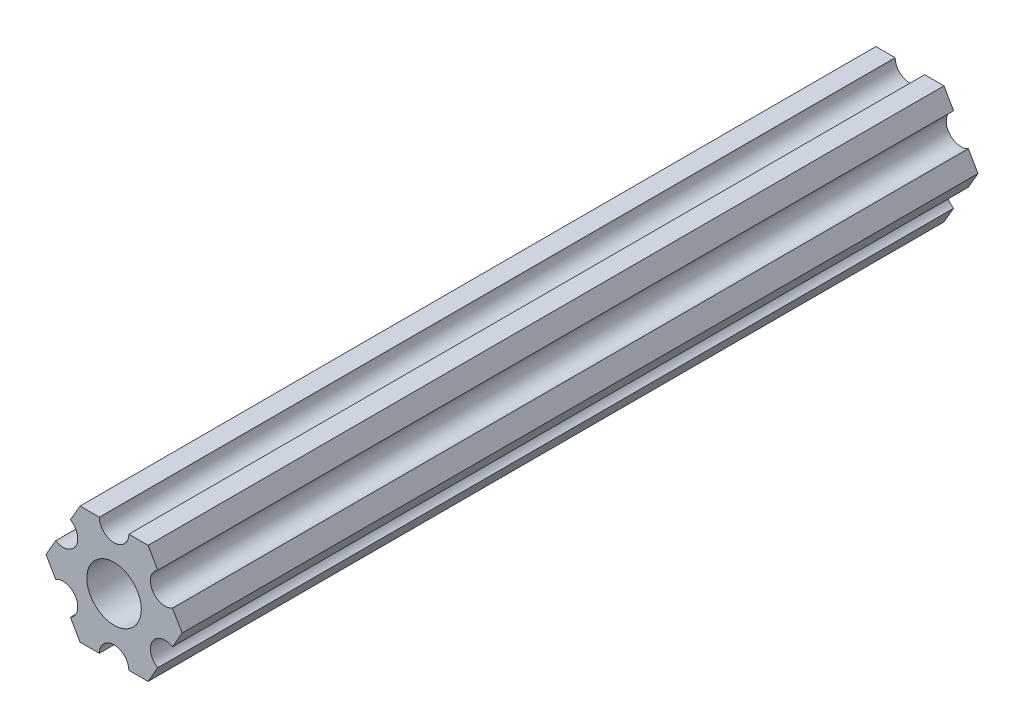
ISO-10303-21;
HEADER;
FILE_DESCRIPTION(('STEP AP214'),'2;1');
FILE_NAME('part.step','',(''),(''),'','','');
FILE_SCHEMA(('AUTOMOTIVE_DESIGN { 1 0 10303 214 1 1 1 1 }'));
ENDSEC;
DATA;
#1=APPLICATION_CONTEXT('core data for automotive mechanical design processes');
#2=APPLICATION_PROTOCOL_DEFINITION('international standard','automotive_design',2000,#1);
#3=PRODUCT_CONTEXT('',#1,'mechanical');
#4=PRODUCT('Part','Part','',(#3));
#5=PRODUCT_RELATED_PRODUCT_CATEGORY('part','',(#4));
#6=PRODUCT_DEFINITION_FORMATION('','',#4);
#7=PRODUCT_DEFINITION_CONTEXT('part definition',#1,'design');
#8=PRODUCT_DEFINITION('design','',#6,#7);
#9=PRODUCT_DEFINITION_SHAPE('','',#8);
#10=(LENGTH_UNIT() NAMED_UNIT(*) SI_UNIT(.MILLI.,.METRE.));
#11=(NAMED_UNIT(*) PLANE_ANGLE_UNIT() SI_UNIT($,.RADIAN.));
#12=(NAMED_UNIT(*) SI_UNIT($,.STERADIAN.) SOLID_ANGLE_UNIT());
#13=UNCERTAINTY_MEASURE_WITH_UNIT(LENGTH_MEASURE(1.E-05),#10,'distance_accuracy_value','');
#14=(GEOMETRIC_REPRESENTATION_CONTEXT(3) GLOBAL_UNCERTAINTY_ASSIGNED_CONTEXT((#13)) GLOBAL_UNIT_ASSIGNED_CONTEXT((#10,
#11,#12)) REPRESENTATION_CONTEXT('',''));
#15=CARTESIAN_POINT('',(0.,0.,0.));
#16=DIRECTION('',(0.,0.,1.));
#17=DIRECTION('',(1.,0.,0.));
#18=AXIS2_PLACEMENT_3D('',#15,#16,#17);
#19=CARTESIAN_POINT('',(5.49926150638083,-3.17499966684068,85.725));
#20=DIRECTION('',(0.,0.,-1.));
#21=DIRECTION('',(-1.,0.,0.));
#22=AXIS2_PLACEMENT_3D('',#19,#20,#21);
#23=CYLINDRICAL_SURFACE('',#22,1.58750000000001);
#24=CARTESIAN_POINT('',(5.49926150638083,-3.17499966684068,0.));
#25=DIRECTION('',(0.,0.,1.));
#26=DIRECTION('',(1.,0.,0.));
#27=AXIS2_PLACEMENT_3D('',#24,#25,#26);
#28=CIRCLE('',#27,1.58750000000001);
#29=CARTESIAN_POINT('',(6.29301142309098,-1.80018429024546,0.));
#30=VERTEX_POINT('',#29);
#31=CARTESIAN_POINT('',(4.70551158967068,-4.54981504343589,0.));
#32=VERTEX_POINT('',#31);
#33=EDGE_CURVE('E189',#30,#32,#28,.T.);
#34=ORIENTED_EDGE('',*,*,#33,.F.);
#35=DIRECTION('',(0.,0.,-1.));
#36=VECTOR('',#35,1.);
#37=CARTESIAN_POINT('',(6.29301142309098,-1.80018429024546,85.725));
#38=LINE('',#37,#36);
#39=CARTESIAN_POINT('',(6.29301142309098,-1.80018429024546,85.725));
#40=VERTEX_POINT('',#39);
#41=EDGE_CURVE('E11',#40,#30,#38,.T.);
#42=ORIENTED_EDGE('',*,*,#41,.F.);
#43=CARTESIAN_POINT('',(5.49926150638083,-3.17499966684068,85.725));
#44=DIRECTION('',(0.,0.,1.));
#45=DIRECTION('',(1.,0.,0.));
#46=AXIS2_PLACEMENT_3D('',#43,#44,#45);
#47=CIRCLE('',#46,1.58750000000001);
#48=CARTESIAN_POINT('',(4.70551158967068,-4.54981504343589,85.725));
#49=VERTEX_POINT('',#48);
#50=EDGE_CURVE('E240',#40,#49,#47,.T.);
#51=ORIENTED_EDGE('',*,*,#50,.T.);
#52=DIRECTION('',(0.,0.,-1.));
#53=VECTOR('',#52,1.);
#54=CARTESIAN_POINT('',(4.70551158967068,-4.54981504343589,85.725));
#55=LINE('',#54,#53);
#56=EDGE_CURVE('E35',#49,#32,#55,.T.);
#57=ORIENTED_EDGE('',*,*,#56,.T.);
#58=EDGE_LOOP('',(#34,#42,#51,#57));
#59=FACE_BOUND('',#58,.T.);
#60=ADVANCED_FACE('F32',(#59),#23,.F.);
#61=CARTESIAN_POINT('',(7.33234841870826,4.44212518856872E-07,85.725));
#62=DIRECTION('',(0.866025434075723,-0.499999947533953,0.));
#63=DIRECTION('',(0.499999947533953,0.866025434075723,0.));
#64=AXIS2_PLACEMENT_3D('',#61,#62,#63);
#65=PLANE('',#64);
#66=DIRECTION('',(-0.499999947533953,-0.866025434075723,0.));
#67=VECTOR('',#66,1.);
#68=CARTESIAN_POINT('',(7.33234841870826,4.44212518856872E-07,0.));
#69=LINE('',#68,#67);
#70=CARTESIAN_POINT('',(7.33234841870826,4.44212518856872E-07,0.));
#71=VERTEX_POINT('',#70);
#72=EDGE_CURVE('E238',#71,#30,#69,.T.);
#73=ORIENTED_EDGE('',*,*,#72,.F.);
#74=DIRECTION('',(0.,0.,-1.));
#75=VECTOR('',#74,1.);
#76=CARTESIAN_POINT('',(7.33234841870826,4.44212518856872E-07,85.725));
#77=LINE('',#76,#75);
#78=CARTESIAN_POINT('',(7.33234841870826,4.44212518856872E-07,85.725));
#79=VERTEX_POINT('',#78);
#80=EDGE_CURVE('E41',#79,#71,#77,.T.);
#81=ORIENTED_EDGE('',*,*,#80,.F.);
#82=DIRECTION('',(-0.499999947533953,-0.866025434075723,0.));
#83=VECTOR('',#82,1.);
#84=CARTESIAN_POINT('',(7.33234841870826,4.44212518856872E-07,85.725));
#85=LINE('',#84,#83);
#86=EDGE_CURVE('E179',#79,#40,#85,.T.);
#87=ORIENTED_EDGE('',*,*,#86,.T.);
#88=ORIENTED_EDGE('',*,*,#41,.T.);
#89=EDGE_LOOP('',(#73,#81,#87,#88));
#90=FACE_BOUND('',#89,.T.);
#91=ADVANCED_FACE('F272',(#90),#65,.T.);
#92=CARTESIAN_POINT('',(6.29301120497139,1.80018505273895,85.725));
#93=DIRECTION('',(0.866025373493145,0.500000052466056,0.));
#94=DIRECTION('',(-0.500000052466056,0.866025373493145,0.));
#95=AXIS2_PLACEMENT_3D('',#92,#93,#94);
#96=PLANE('',#95);
#97=DIRECTION('',(0.500000052466056,-0.866025373493145,0.));
#98=VECTOR('',#97,1.);
#99=CARTESIAN_POINT('',(6.29301120497139,1.80018505273895,0.));
#100=LINE('',#99,#98);
#101=CARTESIAN_POINT('',(6.29301120497139,1.80018505273895,0.));
#102=VERTEX_POINT('',#101);
#103=EDGE_CURVE('E166',#102,#71,#100,.T.);
#104=ORIENTED_EDGE('',*,*,#103,.F.);
#105=DIRECTION('',(0.,0.,-1.));
#106=VECTOR('',#105,1.);
#107=CARTESIAN_POINT('',(6.29301120497139,1.80018505273895,85.725));
#108=LINE('',#107,#106);
#109=CARTESIAN_POINT('',(6.29301120497139,1.80018505273895,85.725));
#110=VERTEX_POINT('',#109);
#111=EDGE_CURVE('E161',#110,#102,#108,.T.);
#112=ORIENTED_EDGE('',*,*,#111,.F.);
#113=DIRECTION('',(0.500000052466056,-0.866025373493145,0.));
#114=VECTOR('',#113,1.);
#115=CARTESIAN_POINT('',(6.29301120497139,1.80018505273895,85.725));
#116=LINE('',#115,#114);
#117=EDGE_CURVE('E164',#110,#79,#116,.T.);
#118=ORIENTED_EDGE('',*,*,#117,.T.);
#119=ORIENTED_EDGE('',*,*,#80,.T.);
#120=EDGE_LOOP('',(#104,#112,#118,#119));
#121=FACE_BOUND('',#120,.T.);
#122=ADVANCED_FACE('F163',(#121),#96,.T.);
#123=CARTESIAN_POINT('',(5.49926112168152,3.17500033315931,85.725));
#124=DIRECTION('',(0.,0.,-1.));
#125=DIRECTION('',(-1.,0.,0.));
#126=AXIS2_PLACEMENT_3D('',#123,#124,#125);
#127=CYLINDRICAL_SURFACE('',#126,1.5875);
#128=CARTESIAN_POINT('',(5.49926112168152,3.17500033315931,0.));
#129=DIRECTION('',(0.,0.,1.));
#130=DIRECTION('',(1.,0.,0.));
#131=AXIS2_PLACEMENT_3D('',#128,#129,#130);
#132=CIRCLE('',#131,1.5875);
#133=CARTESIAN_POINT('',(4.70551103839166,4.54981561357968,0.));
#134=VERTEX_POINT('',#133);
#135=EDGE_CURVE('E235',#134,#102,#132,.T.);
#136=ORIENTED_EDGE('',*,*,#135,.F.);
#137=DIRECTION('',(0.,0.,-1.));
#138=VECTOR('',#137,1.);
#139=CARTESIAN_POINT('',(4.70551103839166,4.54981561357968,85.725));
#140=LINE('',#139,#138);
#141=CARTESIAN_POINT('',(4.70551103839166,4.54981561357968,85.725));
#142=VERTEX_POINT('',#141);
#143=EDGE_CURVE('E171',#142,#134,#140,.T.);
#144=ORIENTED_EDGE('',*,*,#143,.F.);
#145=CARTESIAN_POINT('',(5.49926112168152,3.17500033315931,85.725));
#146=DIRECTION('',(0.,0.,1.));
#147=DIRECTION('',(1.,0.,0.));
#148=AXIS2_PLACEMENT_3D('',#145,#146,#147);
#149=CIRCLE('',#148,1.5875);
#150=EDGE_CURVE('E177',#142,#110,#149,.T.);
#151=ORIENTED_EDGE('',*,*,#150,.T.);
#152=ORIENTED_EDGE('',*,*,#111,.T.);
#153=EDGE_LOOP('',(#136,#144,#151,#152));
#154=FACE_BOUND('',#153,.T.);
#155=ADVANCED_FACE('F181',(#154),#127,.F.);
#156=CARTESIAN_POINT('',(3.66617382465472,6.35000022210622,85.725));
#157=DIRECTION('',(0.866025373493145,0.500000052466056,0.));
#158=DIRECTION('',(-0.500000052466056,0.866025373493145,0.));
#159=AXIS2_PLACEMENT_3D('',#156,#157,#158);
#160=PLANE('',#159);
#161=DIRECTION('',(0.500000052466056,-0.866025373493145,0.));
#162=VECTOR('',#161,1.);
#163=CARTESIAN_POINT('',(3.66617382465472,6.35000022210622,0.));
#164=LINE('',#163,#162);
#165=CARTESIAN_POINT('',(3.66617382465472,6.35000022210622,0.));
#166=VERTEX_POINT('',#165);
#167=EDGE_CURVE('E232',#166,#134,#164,.T.);
#168=ORIENTED_EDGE('',*,*,#167,.F.);
#169=DIRECTION('',(0.,0.,-1.));
#170=VECTOR('',#169,1.);
#171=CARTESIAN_POINT('',(3.66617382465472,6.35000022210622,85.725));
#172=LINE('',#171,#170);
#173=CARTESIAN_POINT('',(3.66617382465472,6.35000022210622,85.725));
#174=VERTEX_POINT('',#173);
#175=EDGE_CURVE('E244',#174,#166,#172,.T.);
#176=ORIENTED_EDGE('',*,*,#175,.F.);
#177=DIRECTION('',(0.500000052466056,-0.866025373493145,0.));
#178=VECTOR('',#177,1.);
#179=CARTESIAN_POINT('',(3.66617382465472,6.35000022210622,85.725));
#180=LINE('',#179,#178);
#181=EDGE_CURVE('E182',#174,#142,#180,.T.);
#182=ORIENTED_EDGE('',*,*,#181,.T.);
#183=ORIENTED_EDGE('',*,*,#143,.T.);
#184=EDGE_LOOP('',(#168,#176,#182,#183));
#185=FACE_BOUND('',#184,.T.);
#186=ADVANCED_FACE('F285',(#185),#160,.T.);
#187=CARTESIAN_POINT('',(1.58749961530066,6.35000022210623,85.725));
#188=DIRECTION('',(0.,1.,0.));
#189=DIRECTION('',(-1.,0.,0.));
#190=AXIS2_PLACEMENT_3D('',#187,#188,#189);
#191=PLANE('',#190);
#192=DIRECTION('',(1.,0.,0.));
#193=VECTOR('',#192,1.);
#194=CARTESIAN_POINT('',(1.58749961530066,6.35000022210623,0.));
#195=LINE('',#194,#193);
#196=CARTESIAN_POINT('',(1.58749961530066,6.35000022210623,0.));
#197=VERTEX_POINT('',#196);
#198=EDGE_CURVE('E229',#197,#166,#195,.T.);
#199=ORIENTED_EDGE('',*,*,#198,.F.);
#200=DIRECTION('',(0.,0.,-1.));
#201=VECTOR('',#200,1.);
#202=CARTESIAN_POINT('',(1.58749961530066,6.35000022210623,85.725));
#203=LINE('',#202,#201);
#204=CARTESIAN_POINT('',(1.58749961530066,6.35000022210623,85.725));
#205=VERTEX_POINT('',#204);
#206=EDGE_CURVE('E246',#205,#197,#203,.T.);
#207=ORIENTED_EDGE('',*,*,#206,.F.);
#208=DIRECTION('',(1.,0.,0.));
#209=VECTOR('',#208,1.);
#210=CARTESIAN_POINT('',(1.58749961530066,6.35000022210623,85.725));
#211=LINE('',#210,#209);
#212=EDGE_CURVE('E184',#205,#174,#211,.T.);
#213=ORIENTED_EDGE('',*,*,#212,.T.);
#214=ORIENTED_EDGE('',*,*,#175,.T.);
#215=EDGE_LOOP('',(#199,#207,#213,#214));
#216=FACE_BOUND('',#215,.T.);
#217=ADVANCED_FACE('F288',(#216),#191,.T.);
#218=CARTESIAN_POINT('',(-3.84699344941095E-07,6.35000022210623,85.725));
#219=DIRECTION('',(0.,0.,-1.));
#220=DIRECTION('',(-1.,0.,0.));
#221=AXIS2_PLACEMENT_3D('',#218,#219,#220);
#222=CYLINDRICAL_SURFACE('',#221,1.5875);
#223=CARTESIAN_POINT('',(-3.84699344941095E-07,6.35000022210623,0.));
#224=DIRECTION('',(0.,0.,1.));
#225=DIRECTION('',(1.,0.,0.));
#226=AXIS2_PLACEMENT_3D('',#223,#224,#225);
#227=CIRCLE('',#226,1.5875);
#228=CARTESIAN_POINT('',(-1.58750038469935,6.35000022210623,0.));
#229=VERTEX_POINT('',#228);
#230=EDGE_CURVE('E226',#229,#197,#227,.T.);
#231=ORIENTED_EDGE('',*,*,#230,.F.);
#232=DIRECTION('',(0.,0.,-1.));
#233=VECTOR('',#232,1.);
#234=CARTESIAN_POINT('',(-1.58750038469935,6.35000022210623,85.725));
#235=LINE('',#234,#233);
#236=CARTESIAN_POINT('',(-1.58750038469935,6.35000022210623,85.725));
#237=VERTEX_POINT('',#236);
#238=EDGE_CURVE('E248',#237,#229,#235,.T.);
#239=ORIENTED_EDGE('',*,*,#238,.F.);
#240=CARTESIAN_POINT('',(-3.84699344941095E-07,6.35000022210623,85.725));
#241=DIRECTION('',(0.,0.,1.));
#242=DIRECTION('',(1.,0.,0.));
#243=AXIS2_PLACEMENT_3D('',#240,#241,#242);
#244=CIRCLE('',#243,1.5875);
#245=EDGE_CURVE('E393',#237,#205,#244,.T.);
#246=ORIENTED_EDGE('',*,*,#245,.T.);
#247=ORIENTED_EDGE('',*,*,#206,.T.);
#248=EDGE_LOOP('',(#231,#239,#246,#247));
#249=FACE_BOUND('',#248,.T.);
#250=ADVANCED_FACE('F292',(#249),#222,.F.);
#251=CARTESIAN_POINT('',(-3.66617452134701,6.35000022210623,85.725));
#252=DIRECTION('',(0.,1.,0.));
#253=DIRECTION('',(0.,0.,1.));
#254=AXIS2_PLACEMENT_3D('',#251,#252,#253);
#255=PLANE('',#254);
#256=DIRECTION('',(1.,0.,0.));
#257=VECTOR('',#256,1.);
#258=CARTESIAN_POINT('',(-3.66617452134701,6.35000022210623,0.));
#259=LINE('',#258,#257);
#260=CARTESIAN_POINT('',(-3.66617452134701,6.35000022210623,0.));
#261=VERTEX_POINT('',#260);
#262=EDGE_CURVE('E223',#261,#229,#259,.T.);
#263=ORIENTED_EDGE('',*,*,#262,.F.);
#264=DIRECTION('',(0.,0.,-1.));
#265=VECTOR('',#264,1.);
#266=CARTESIAN_POINT('',(-3.66617452134701,6.35000022210623,85.725));
#267=LINE('',#266,#265);
#268=CARTESIAN_POINT('',(-3.66617452134701,6.35000022210623,85.725));
#269=VERTEX_POINT('',#268);
#270=EDGE_CURVE('E250',#269,#261,#267,.T.);
#271=ORIENTED_EDGE('',*,*,#270,.F.);
#272=DIRECTION('',(1.,0.,0.));
#273=VECTOR('',#272,1.);
#274=CARTESIAN_POINT('',(-3.66617452134701,6.35000022210623,85.725));
#275=LINE('',#274,#273);
#276=EDGE_CURVE('E390',#269,#237,#275,.T.);
#277=ORIENTED_EDGE('',*,*,#276,.T.);
#278=ORIENTED_EDGE('',*,*,#238,.T.);
#279=EDGE_LOOP('',(#263,#271,#277,#278));
#280=FACE_BOUND('',#279,.T.);
#281=ADVANCED_FACE('F296',(#280),#255,.T.);
#282=CARTESIAN_POINT('',(-4.70551145677116,4.54981548085265,85.725));
#283=DIRECTION('',(-0.866025447431971,0.499999924400249,0.));
#284=DIRECTION('',(-0.499999924400249,-0.866025447431971,0.));
#285=AXIS2_PLACEMENT_3D('',#282,#283,#284);
#286=PLANE('',#285);
#287=DIRECTION('',(0.499999924400249,0.866025447431971,0.));
#288=VECTOR('',#287,1.);
#289=CARTESIAN_POINT('',(-4.70551145677116,4.54981548085265,0.));
#290=LINE('',#289,#288);
#291=CARTESIAN_POINT('',(-4.70551145677116,4.54981548085265,0.));
#292=VERTEX_POINT('',#291);
#293=EDGE_CURVE('E220',#292,#261,#290,.T.);
#294=ORIENTED_EDGE('',*,*,#293,.F.);
#295=DIRECTION('',(0.,0.,-1.));
#296=VECTOR('',#295,1.);
#297=CARTESIAN_POINT('',(-4.70551145677116,4.54981548085265,85.725));
#298=LINE('',#297,#296);
#299=CARTESIAN_POINT('',(-4.70551145677116,4.54981548085265,85.725));
#300=VERTEX_POINT('',#299);
#301=EDGE_CURVE('E252',#300,#292,#298,.T.);
#302=ORIENTED_EDGE('',*,*,#301,.F.);
#303=DIRECTION('',(0.499999924400249,0.866025447431971,0.));
#304=VECTOR('',#303,1.);
#305=CARTESIAN_POINT('',(-4.70551145677116,4.54981548085265,85.725));
#306=LINE('',#305,#304);
#307=EDGE_CURVE('E387',#300,#269,#306,.T.);
#308=ORIENTED_EDGE('',*,*,#307,.T.);
#309=ORIENTED_EDGE('',*,*,#270,.T.);
#310=EDGE_LOOP('',(#294,#302,#308,#309));
#311=FACE_BOUND('',#310,.T.);
#312=ADVANCED_FACE('F300',(#311),#286,.T.);
#313=CARTESIAN_POINT('',(-5.49926133675655,3.17500008305439,85.725));
#314=DIRECTION('',(0.,0.,-1.));
#315=DIRECTION('',(-1.,0.,0.));
#316=AXIS2_PLACEMENT_3D('',#313,#314,#315);
#317=CYLINDRICAL_SURFACE('',#316,1.5875);
#318=CARTESIAN_POINT('',(-5.49926133675655,3.17500008305439,0.));
#319=DIRECTION('',(0.,0.,1.));
#320=DIRECTION('',(1.,0.,0.));
#321=AXIS2_PLACEMENT_3D('',#318,#319,#320);
#322=CIRCLE('',#321,1.5875);
#323=CARTESIAN_POINT('',(-6.29301121674195,1.80018468525613,0.));
#324=VERTEX_POINT('',#323);
#325=EDGE_CURVE('E217',#324,#292,#322,.T.);
#326=ORIENTED_EDGE('',*,*,#325,.F.);
#327=DIRECTION('',(0.,0.,-1.));
#328=VECTOR('',#327,1.);
#329=CARTESIAN_POINT('',(-6.29301121674195,1.80018468525613,85.725));
#330=LINE('',#329,#328);
#331=CARTESIAN_POINT('',(-6.29301121674195,1.80018468525613,85.725));
#332=VERTEX_POINT('',#331);
#333=EDGE_CURVE('E254',#332,#324,#330,.T.);
#334=ORIENTED_EDGE('',*,*,#333,.F.);
#335=CARTESIAN_POINT('',(-5.49926133675655,3.17500008305439,85.725));
#336=DIRECTION('',(0.,0.,1.));
#337=DIRECTION('',(1.,0.,0.));
#338=AXIS2_PLACEMENT_3D('',#335,#336,#337);
#339=CIRCLE('',#338,1.5875);
#340=EDGE_CURVE('E384',#332,#300,#339,.T.);
#341=ORIENTED_EDGE('',*,*,#340,.T.);
#342=ORIENTED_EDGE('',*,*,#301,.T.);
#343=EDGE_LOOP('',(#326,#334,#341,#342));
#344=FACE_BOUND('',#343,.T.);
#345=ADVANCED_FACE('F304',(#344),#317,.F.);
#346=CARTESIAN_POINT('',(-7.33234807945963,6.99338729030344E-08,85.725));
#347=DIRECTION('',(-0.866025447431971,0.499999924400249,0.));
#348=DIRECTION('',(-0.499999924400249,-0.866025447431971,0.));
#349=AXIS2_PLACEMENT_3D('',#346,#347,#348);
#350=PLANE('',#349);
#351=DIRECTION('',(0.499999924400249,0.866025447431971,0.));
#352=VECTOR('',#351,1.);
#353=CARTESIAN_POINT('',(-7.33234807945963,6.99338729030344E-08,0.));
#354=LINE('',#353,#352);
#355=CARTESIAN_POINT('',(-7.33234807945963,6.99338729030344E-08,0.));
#356=VERTEX_POINT('',#355);
#357=EDGE_CURVE('E214',#356,#324,#354,.T.);
#358=ORIENTED_EDGE('',*,*,#357,.F.);
#359=DIRECTION('',(0.,0.,-1.));
#360=VECTOR('',#359,1.);
#361=CARTESIAN_POINT('',(-7.33234807945963,6.99338729030344E-08,85.725));
#362=LINE('',#361,#360);
#363=CARTESIAN_POINT('',(-7.33234807945963,6.99338729030344E-08,85.725));
#364=VERTEX_POINT('',#363);
#365=EDGE_CURVE('E256',#364,#356,#362,.T.);
#366=ORIENTED_EDGE('',*,*,#365,.F.);
#367=DIRECTION('',(0.499999924400249,0.866025447431971,0.));
#368=VECTOR('',#367,1.);
#369=CARTESIAN_POINT('',(-7.33234807945963,6.99338729030344E-08,85.725));
#370=LINE('',#369,#368);
#371=EDGE_CURVE('E381',#364,#332,#370,.T.);
#372=ORIENTED_EDGE('',*,*,#371,.T.);
#373=ORIENTED_EDGE('',*,*,#333,.T.);
#374=EDGE_LOOP('',(#358,#366,#372,#373));
#375=FACE_BOUND('',#374,.T.);
#376=ADVANCED_FACE('F308',(#375),#350,.T.);
#377=CARTESIAN_POINT('',(-6.29301096189761,-1.80018459411914,85.725));
#378=DIRECTION('',(-0.866025400205645,-0.500000006198653,0.));
#379=DIRECTION('',(0.500000006198653,-0.866025400205645,0.));
#380=AXIS2_PLACEMENT_3D('',#377,#378,#379);
#381=PLANE('',#380);
#382=DIRECTION('',(-0.500000006198653,0.866025400205645,0.));
#383=VECTOR('',#382,1.);
#384=CARTESIAN_POINT('',(-6.29301096189761,-1.80018459411914,0.));
#385=LINE('',#384,#383);
#386=CARTESIAN_POINT('',(-6.29301096189761,-1.80018459411914,0.));
#387=VERTEX_POINT('',#386);
#388=EDGE_CURVE('E211',#387,#356,#385,.T.);
#389=ORIENTED_EDGE('',*,*,#388,.F.);
#390=DIRECTION('',(0.,0.,-1.));
#391=VECTOR('',#390,1.);
#392=CARTESIAN_POINT('',(-6.29301096189761,-1.80018459411914,85.725));
#393=LINE('',#392,#391);
#394=CARTESIAN_POINT('',(-6.29301096189761,-1.80018459411914,85.725));
#395=VERTEX_POINT('',#394);
#396=EDGE_CURVE('E258',#395,#387,#393,.T.);
#397=ORIENTED_EDGE('',*,*,#396,.F.);
#398=DIRECTION('',(-0.500000006198653,0.866025400205645,0.));
#399=VECTOR('',#398,1.);
#400=CARTESIAN_POINT('',(-6.29301096189761,-1.80018459411914,85.725));
#401=LINE('',#400,#399);
#402=EDGE_CURVE('E378',#395,#364,#401,.T.);
#403=ORIENTED_EDGE('',*,*,#402,.T.);
#404=ORIENTED_EDGE('',*,*,#365,.T.);
#405=EDGE_LOOP('',(#389,#397,#403,#404));
#406=FACE_BOUND('',#405,.T.);
#407=ADVANCED_FACE('F312',(#406),#381,.T.);
#408=CARTESIAN_POINT('',(-5.49926095205725,-3.1749999169456,85.725));
#409=DIRECTION('',(0.,0.,-1.));
#410=DIRECTION('',(-1.,0.,0.));
#411=AXIS2_PLACEMENT_3D('',#408,#409,#410);
#412=CYLINDRICAL_SURFACE('',#411,1.5875);
#413=CARTESIAN_POINT('',(-5.49926095205725,-3.1749999169456,0.));
#414=DIRECTION('',(0.,0.,1.));
#415=DIRECTION('',(1.,0.,0.));
#416=AXIS2_PLACEMENT_3D('',#413,#414,#415);
#417=CIRCLE('',#416,1.5875);
#418=CARTESIAN_POINT('',(-4.70551094221689,-4.54981523977206,0.));
#419=VERTEX_POINT('',#418);
#420=EDGE_CURVE('E208',#419,#387,#417,.T.);
#421=ORIENTED_EDGE('',*,*,#420,.F.);
#422=DIRECTION('',(0.,0.,-1.));
#423=VECTOR('',#422,1.);
#424=CARTESIAN_POINT('',(-4.70551094221689,-4.54981523977206,85.725));
#425=LINE('',#424,#423);
#426=CARTESIAN_POINT('',(-4.70551094221689,-4.54981523977206,85.725));
#427=VERTEX_POINT('',#426);
#428=EDGE_CURVE('E260',#427,#419,#425,.T.);
#429=ORIENTED_EDGE('',*,*,#428,.F.);
#430=CARTESIAN_POINT('',(-5.49926095205725,-3.1749999169456,85.725));
#431=DIRECTION('',(0.,0.,1.));
#432=DIRECTION('',(1.,0.,0.));
#433=AXIS2_PLACEMENT_3D('',#430,#431,#432);
#434=CIRCLE('',#433,1.5875);
#435=EDGE_CURVE('E375',#427,#395,#434,.T.);
#436=ORIENTED_EDGE('',*,*,#435,.T.);
#437=ORIENTED_EDGE('',*,*,#396,.T.);
#438=EDGE_LOOP('',(#421,#429,#436,#437));
#439=FACE_BOUND('',#438,.T.);
#440=ADVANCED_FACE('F316',(#439),#412,.F.);
#441=CARTESIAN_POINT('',(-3.66617382465481,-6.34999990382519,85.725));
#442=DIRECTION('',(-0.866025400205645,-0.500000006198653,0.));
#443=DIRECTION('',(0.500000006198653,-0.866025400205645,0.));
#444=AXIS2_PLACEMENT_3D('',#441,#442,#443);
#445=PLANE('',#444);
#446=DIRECTION('',(-0.500000006198653,0.866025400205644,0.));
#447=VECTOR('',#446,1.);
#448=CARTESIAN_POINT('',(-3.66617382465481,-6.34999990382519,0.));
#449=LINE('',#448,#447);
#450=CARTESIAN_POINT('',(-3.66617382465481,-6.34999990382519,0.));
#451=VERTEX_POINT('',#450);
#452=EDGE_CURVE('E205',#451,#419,#449,.T.);
#453=ORIENTED_EDGE('',*,*,#452,.F.);
#454=DIRECTION('',(0.,0.,-1.));
#455=VECTOR('',#454,1.);
#456=CARTESIAN_POINT('',(-3.66617382465481,-6.34999990382519,85.725));
#457=LINE('',#456,#455);
#458=CARTESIAN_POINT('',(-3.66617382465481,-6.34999990382519,85.725));
#459=VERTEX_POINT('',#458);
#460=EDGE_CURVE('E262',#459,#451,#457,.T.);
#461=ORIENTED_EDGE('',*,*,#460,.F.);
#462=DIRECTION('',(-0.500000006198653,0.866025400205644,0.));
#463=VECTOR('',#462,1.);
#464=CARTESIAN_POINT('',(-3.66617382465481,-6.34999990382519,85.725));
#465=LINE('',#464,#463);
#466=EDGE_CURVE('E372',#459,#427,#465,.T.);
#467=ORIENTED_EDGE('',*,*,#466,.T.);
#468=ORIENTED_EDGE('',*,*,#428,.T.);
#469=EDGE_LOOP('',(#453,#461,#467,#468));
#470=FACE_BOUND('',#469,.T.);
#471=ADVANCED_FACE('F320',(#470),#445,.T.);
#472=CARTESIAN_POINT('',(-1.58749961530074,-6.34999990382519,85.725));
#473=DIRECTION('',(0.,-1.,0.));
#474=DIRECTION('',(1.,0.,0.));
#475=AXIS2_PLACEMENT_3D('',#472,#473,#474);
#476=PLANE('',#475);
#477=DIRECTION('',(-1.,0.,0.));
#478=VECTOR('',#477,1.);
#479=CARTESIAN_POINT('',(-1.58749961530074,-6.34999990382519,0.));
#480=LINE('',#479,#478);
#481=CARTESIAN_POINT('',(-1.58749961530074,-6.34999990382519,0.));
#482=VERTEX_POINT('',#481);
#483=EDGE_CURVE('E202',#482,#451,#480,.T.);
#484=ORIENTED_EDGE('',*,*,#483,.F.);
#485=DIRECTION('',(0.,0.,-1.));
#486=VECTOR('',#485,1.);
#487=CARTESIAN_POINT('',(-1.58749961530074,-6.34999990382519,85.725));
#488=LINE('',#487,#486);
#489=CARTESIAN_POINT('',(-1.58749961530074,-6.34999990382519,85.725));
#490=VERTEX_POINT('',#489);
#491=EDGE_CURVE('E264',#490,#482,#488,.T.);
#492=ORIENTED_EDGE('',*,*,#491,.F.);
#493=DIRECTION('',(-1.,0.,0.));
#494=VECTOR('',#493,1.);
#495=CARTESIAN_POINT('',(-1.58749961530074,-6.34999990382519,85.725));
#496=LINE('',#495,#494);
#497=EDGE_CURVE('E369',#490,#459,#496,.T.);
#498=ORIENTED_EDGE('',*,*,#497,.T.);
#499=ORIENTED_EDGE('',*,*,#460,.T.);
#500=EDGE_LOOP('',(#484,#492,#498,#499));
#501=FACE_BOUND('',#500,.T.);
#502=ADVANCED_FACE('F324',(#501),#476,.T.);
#503=CARTESIAN_POINT('',(3.8469926204343E-07,-6.34999990382519,85.725));
#504=DIRECTION('',(0.,0.,-1.));
#505=DIRECTION('',(-1.,0.,0.));
#506=AXIS2_PLACEMENT_3D('',#503,#504,#505);
#507=CYLINDRICAL_SURFACE('',#506,1.5875);
#508=CARTESIAN_POINT('',(3.8469926204343E-07,-6.34999990382519,0.));
#509=DIRECTION('',(0.,0.,1.));
#510=DIRECTION('',(1.,0.,0.));
#511=AXIS2_PLACEMENT_3D('',#508,#509,#510);
#512=CIRCLE('',#511,1.5875);
#513=CARTESIAN_POINT('',(1.58750038469926,-6.34999990382518,0.));
#514=VERTEX_POINT('',#513);
#515=EDGE_CURVE('E199',#514,#482,#512,.T.);
#516=ORIENTED_EDGE('',*,*,#515,.F.);
#517=DIRECTION('',(0.,0.,-1.));
#518=VECTOR('',#517,1.);
#519=CARTESIAN_POINT('',(1.58750038469926,-6.34999990382518,85.725));
#520=LINE('',#519,#518);
#521=CARTESIAN_POINT('',(1.58750038469926,-6.34999990382518,85.725));
#522=VERTEX_POINT('',#521);
#523=EDGE_CURVE('E266',#522,#514,#520,.T.);
#524=ORIENTED_EDGE('',*,*,#523,.F.);
#525=CARTESIAN_POINT('',(3.8469926204343E-07,-6.34999990382519,85.725));
#526=DIRECTION('',(0.,0.,1.));
#527=DIRECTION('',(1.,0.,0.));
#528=AXIS2_PLACEMENT_3D('',#525,#526,#527);
#529=CIRCLE('',#528,1.5875);
#530=EDGE_CURVE('E366',#522,#490,#529,.T.);
#531=ORIENTED_EDGE('',*,*,#530,.T.);
#532=ORIENTED_EDGE('',*,*,#491,.T.);
#533=EDGE_LOOP('',(#516,#524,#531,#532));
#534=FACE_BOUND('',#533,.T.);
#535=ADVANCED_FACE('F328',(#534),#507,.F.);
#536=CARTESIAN_POINT('',(3.66617452134693,-6.34999990382519,85.725));
#537=DIRECTION('',(0.,-1.,0.));
#538=DIRECTION('',(1.,0.,0.));
#539=AXIS2_PLACEMENT_3D('',#536,#537,#538);
#540=PLANE('',#539);
#541=DIRECTION('',(-1.,0.,0.));
#542=VECTOR('',#541,1.);
#543=CARTESIAN_POINT('',(3.66617452134693,-6.34999990382519,0.));
#544=LINE('',#543,#542);
#545=CARTESIAN_POINT('',(3.66617452134693,-6.34999990382519,0.));
#546=VERTEX_POINT('',#545);
#547=EDGE_CURVE('E196',#546,#514,#544,.T.);
#548=ORIENTED_EDGE('',*,*,#547,.F.);
#549=DIRECTION('',(0.,0.,-1.));
#550=VECTOR('',#549,1.);
#551=CARTESIAN_POINT('',(3.66617452134693,-6.34999990382519,85.725));
#552=LINE('',#551,#550);
#553=CARTESIAN_POINT('',(3.66617452134693,-6.34999990382519,85.725));
#554=VERTEX_POINT('',#553);
#555=EDGE_CURVE('E267',#554,#546,#552,.T.);
#556=ORIENTED_EDGE('',*,*,#555,.F.);
#557=DIRECTION('',(-1.,0.,0.));
#558=VECTOR('',#557,1.);
#559=CARTESIAN_POINT('',(3.66617452134693,-6.34999990382519,85.725));
#560=LINE('',#559,#558);
#561=EDGE_CURVE('E363',#554,#522,#560,.T.);
#562=ORIENTED_EDGE('',*,*,#561,.T.);
#563=ORIENTED_EDGE('',*,*,#523,.T.);
#564=EDGE_LOOP('',(#548,#556,#562,#563));
#565=FACE_BOUND('',#564,.T.);
#566=ADVANCED_FACE('F332',(#565),#540,.T.);
#567=CARTESIAN_POINT('',(4.70551158967068,-4.54981504343589,85.725));
#568=DIRECTION('',(0.866025434075723,-0.499999947533953,0.));
#569=DIRECTION('',(0.499999947533953,0.866025434075723,0.));
#570=AXIS2_PLACEMENT_3D('',#567,#568,#569);
#571=PLANE('',#570);
#572=DIRECTION('',(-0.499999947533953,-0.866025434075723,0.));
#573=VECTOR('',#572,1.);
#574=CARTESIAN_POINT('',(4.70551158967068,-4.54981504343589,0.));
#575=LINE('',#574,#573);
#576=EDGE_CURVE('E192',#32,#546,#575,.T.);
#577=ORIENTED_EDGE('',*,*,#576,.F.);
#578=ORIENTED_EDGE('',*,*,#56,.F.);
#579=DIRECTION('',(-0.499999947533953,-0.866025434075723,0.));
#580=VECTOR('',#579,1.);
#581=CARTESIAN_POINT('',(4.70551158967068,-4.54981504343589,85.725));
#582=LINE('',#581,#580);
#583=EDGE_CURVE('E361',#49,#554,#582,.T.);
#584=ORIENTED_EDGE('',*,*,#583,.T.);
#585=ORIENTED_EDGE('',*,*,#555,.T.);
#586=EDGE_LOOP('',(#577,#578,#584,#585));
#587=FACE_BOUND('',#586,.T.);
#588=ADVANCED_FACE('F269',(#587),#571,.T.);
#589=CARTESIAN_POINT('',(5.49926150638083,-3.17499966684068,85.725));
#590=DIRECTION('',(0.,0.,1.));
#591=DIRECTION('',(1.,0.,0.));
#592=AXIS2_PLACEMENT_3D('',#589,#590,#591);
#593=PLANE('',#592);
#594=CARTESIAN_POINT('',(0.,0.,85.725));
#595=DIRECTION('',(0.,0.,-1.));
#596=DIRECTION('',(1.,0.,0.));
#597=AXIS2_PLACEMENT_3D('',#594,#595,#596);
#598=CIRCLE('',#597,2.9337);
#599=CARTESIAN_POINT('',(2.9337,0.,85.725));
#600=VERTEX_POINT('',#599);
#601=EDGE_CURVE('E193',#600,#600,#598,.T.);
#602=ORIENTED_EDGE('',*,*,#601,.T.);
#603=EDGE_LOOP('',(#602));
#604=FACE_BOUND('',#603,.T.);
#605=ORIENTED_EDGE('',*,*,#50,.F.);
#606=ORIENTED_EDGE('',*,*,#86,.F.);
#607=ORIENTED_EDGE('',*,*,#117,.F.);
#608=ORIENTED_EDGE('',*,*,#150,.F.);
#609=ORIENTED_EDGE('',*,*,#181,.F.);
#610=ORIENTED_EDGE('',*,*,#212,.F.);
#611=ORIENTED_EDGE('',*,*,#245,.F.);
#612=ORIENTED_EDGE('',*,*,#276,.F.);
#613=ORIENTED_EDGE('',*,*,#307,.F.);
#614=ORIENTED_EDGE('',*,*,#340,.F.);
#615=ORIENTED_EDGE('',*,*,#371,.F.);
#616=ORIENTED_EDGE('',*,*,#402,.F.);
#617=ORIENTED_EDGE('',*,*,#435,.F.);
#618=ORIENTED_EDGE('',*,*,#466,.F.);
#619=ORIENTED_EDGE('',*,*,#497,.F.);
#620=ORIENTED_EDGE('',*,*,#530,.F.);
#621=ORIENTED_EDGE('',*,*,#561,.F.);
#622=ORIENTED_EDGE('',*,*,#583,.F.);
#623=EDGE_LOOP('',(#605,#606,#607,#608,#609,#610,#611,#612,#613,#614,#615,#616,#617,#618,#619,
#620,#621,#622));
#624=FACE_BOUND('',#623,.T.);
#625=ADVANCED_FACE('F175',(#604,#624),#593,.T.);
#626=CARTESIAN_POINT('',(5.49926150638083,-3.17499966684068,0.));
#627=DIRECTION('',(0.,0.,1.));
#628=DIRECTION('',(1.,0.,0.));
#629=AXIS2_PLACEMENT_3D('',#626,#627,#628);
#630=PLANE('',#629);
#631=CARTESIAN_POINT('',(0.,0.,0.));
#632=DIRECTION('',(0.,0.,-1.));
#633=DIRECTION('',(1.,0.,0.));
#634=AXIS2_PLACEMENT_3D('',#631,#632,#633);
#635=CIRCLE('',#634,2.9337);
#636=CARTESIAN_POINT('',(2.9337,0.,0.));
#637=VERTEX_POINT('',#636);
#638=EDGE_CURVE('E356',#637,#637,#635,.T.);
#639=ORIENTED_EDGE('',*,*,#638,.F.);
#640=EDGE_LOOP('',(#639));
#641=FACE_BOUND('',#640,.T.);
#642=ORIENTED_EDGE('',*,*,#33,.T.);
#643=ORIENTED_EDGE('',*,*,#576,.T.);
#644=ORIENTED_EDGE('',*,*,#547,.T.);
#645=ORIENTED_EDGE('',*,*,#515,.T.);
#646=ORIENTED_EDGE('',*,*,#483,.T.);
#647=ORIENTED_EDGE('',*,*,#452,.T.);
#648=ORIENTED_EDGE('',*,*,#420,.T.);
#649=ORIENTED_EDGE('',*,*,#388,.T.);
#650=ORIENTED_EDGE('',*,*,#357,.T.);
#651=ORIENTED_EDGE('',*,*,#325,.T.);
#652=ORIENTED_EDGE('',*,*,#293,.T.);
#653=ORIENTED_EDGE('',*,*,#262,.T.);
#654=ORIENTED_EDGE('',*,*,#230,.T.);
#655=ORIENTED_EDGE('',*,*,#198,.T.);
#656=ORIENTED_EDGE('',*,*,#167,.T.);
#657=ORIENTED_EDGE('',*,*,#135,.T.);
#658=ORIENTED_EDGE('',*,*,#103,.T.);
#659=ORIENTED_EDGE('',*,*,#72,.T.);
#660=EDGE_LOOP('',(#642,#643,#644,#645,#646,#647,#648,#649,#650,#651,#652,#653,#654,#655,#656,
#657,#658,#659));
#661=FACE_BOUND('',#660,.T.);
#662=ADVANCED_FACE('F271',(#641,#661),#630,.F.);
#663=CARTESIAN_POINT('',(0.,0.,85.725));
#664=DIRECTION('',(0.,0.,-1.));
#665=DIRECTION('',(-1.,0.,0.));
#666=AXIS2_PLACEMENT_3D('',#663,#664,#665);
#667=CYLINDRICAL_SURFACE('',#666,2.9337);
#668=ORIENTED_EDGE('',*,*,#601,.F.);
#669=EDGE_LOOP('',(#668));
#670=FACE_BOUND('',#669,.T.);
#671=ORIENTED_EDGE('',*,*,#638,.T.);
#672=EDGE_LOOP('',(#671));
#673=FACE_BOUND('',#672,.T.);
#674=ADVANCED_FACE('F344',(#670,#673),#667,.F.);
#675=CLOSED_SHELL('',(#60,#91,#122,#155,#186,#217,#250,#281,#312,#345,#376,#407,#440,#471,#502,
#535,#566,#588,#625,#662,#674));
#676=MANIFOLD_SOLID_BREP('B2',#675);
#677=ADVANCED_BREP_SHAPE_REPRESENTATION('',(#18,#676),#14);
#678=SHAPE_DEFINITION_REPRESENTATION(#9,#677);
ENDSEC;
END-ISO-10303-21;
